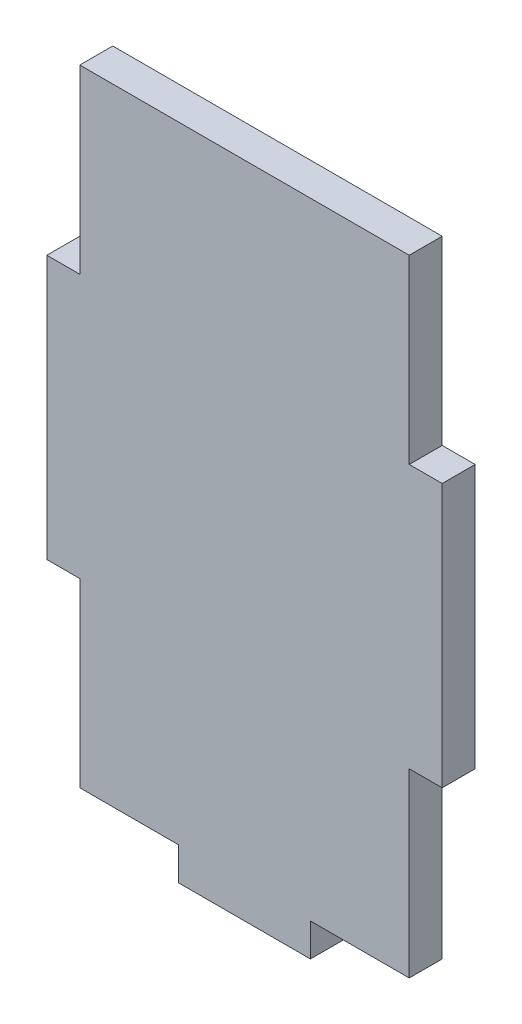
ISO-10303-21;
HEADER;
FILE_DESCRIPTION(('STEP AP214'),'2;1');
FILE_NAME('part.step','',(''),(''),'','','');
FILE_SCHEMA(('AUTOMOTIVE_DESIGN { 1 0 10303 214 1 1 1 1 }'));
ENDSEC;
DATA;
#1=APPLICATION_CONTEXT('core data for automotive mechanical design processes');
#2=APPLICATION_PROTOCOL_DEFINITION('international standard','automotive_design',2000,#1);
#3=PRODUCT_CONTEXT('',#1,'mechanical');
#4=PRODUCT('Part','Part','',(#3));
#5=PRODUCT_RELATED_PRODUCT_CATEGORY('part','',(#4));
#6=PRODUCT_DEFINITION_FORMATION('','',#4);
#7=PRODUCT_DEFINITION_CONTEXT('part definition',#1,'design');
#8=PRODUCT_DEFINITION('design','',#6,#7);
#9=PRODUCT_DEFINITION_SHAPE('','',#8);
#10=(LENGTH_UNIT() NAMED_UNIT(*) SI_UNIT(.MILLI.,.METRE.));
#11=(NAMED_UNIT(*) PLANE_ANGLE_UNIT() SI_UNIT($,.RADIAN.));
#12=(NAMED_UNIT(*) SI_UNIT($,.STERADIAN.) SOLID_ANGLE_UNIT());
#13=UNCERTAINTY_MEASURE_WITH_UNIT(LENGTH_MEASURE(1.E-05),#10,'distance_accuracy_value','');
#14=(GEOMETRIC_REPRESENTATION_CONTEXT(3) GLOBAL_UNCERTAINTY_ASSIGNED_CONTEXT((#13)) GLOBAL_UNIT_ASSIGNED_CONTEXT((#10,
#11,#12)) REPRESENTATION_CONTEXT('',''));
#15=CARTESIAN_POINT('',(0.,0.,0.));
#16=DIRECTION('',(0.,0.,1.));
#17=DIRECTION('',(1.,0.,0.));
#18=AXIS2_PLACEMENT_3D('',#15,#16,#17);
#19=CARTESIAN_POINT('',(-31.75,60.325,3.175));
#20=DIRECTION('',(1.,0.,0.));
#21=DIRECTION('',(0.,0.,-1.));
#22=AXIS2_PLACEMENT_3D('',#19,#20,#21);
#23=PLANE('',#22);
#24=DIRECTION('',(0.,-1.,0.));
#25=VECTOR('',#24,1.);
#26=CARTESIAN_POINT('',(-31.75,60.325,-3.175));
#27=LINE('',#26,#25);
#28=CARTESIAN_POINT('',(-31.75,60.325,-3.175));
#29=VERTEX_POINT('',#28);
#30=CARTESIAN_POINT('',(-31.75,25.4,-3.175));
#31=VERTEX_POINT('',#30);
#32=EDGE_CURVE('E187',#29,#31,#27,.T.);
#33=ORIENTED_EDGE('',*,*,#32,.T.);
#34=DIRECTION('',(0.,0.,-1.));
#35=VECTOR('',#34,1.);
#36=CARTESIAN_POINT('',(-31.75,25.4,3.175));
#37=LINE('',#36,#35);
#38=CARTESIAN_POINT('',(-31.75,25.4,3.175));
#39=VERTEX_POINT('',#38);
#40=EDGE_CURVE('E11',#39,#31,#37,.T.);
#41=ORIENTED_EDGE('',*,*,#40,.F.);
#42=DIRECTION('',(0.,-1.,0.));
#43=VECTOR('',#42,1.);
#44=CARTESIAN_POINT('',(-31.75,60.325,3.175));
#45=LINE('',#44,#43);
#46=CARTESIAN_POINT('',(-31.75,60.325,3.175));
#47=VERTEX_POINT('',#46);
#48=EDGE_CURVE('E233',#47,#39,#45,.T.);
#49=ORIENTED_EDGE('',*,*,#48,.F.);
#50=DIRECTION('',(0.,0.,-1.));
#51=VECTOR('',#50,1.);
#52=CARTESIAN_POINT('',(-31.75,60.325,3.175));
#53=LINE('',#52,#51);
#54=EDGE_CURVE('E183',#47,#29,#53,.T.);
#55=ORIENTED_EDGE('',*,*,#54,.T.);
#56=EDGE_LOOP('',(#33,#41,#49,#55));
#57=FACE_BOUND('',#56,.T.);
#58=ADVANCED_FACE('F38',(#57),#23,.F.);
#59=CARTESIAN_POINT('',(-31.75,25.4,3.175));
#60=DIRECTION('',(0.,-1.,0.));
#61=DIRECTION('',(0.,0.,-1.));
#62=AXIS2_PLACEMENT_3D('',#59,#60,#61);
#63=PLANE('',#62);
#64=DIRECTION('',(-1.,0.,0.));
#65=VECTOR('',#64,1.);
#66=CARTESIAN_POINT('',(-31.75,25.4,-3.175));
#67=LINE('',#66,#65);
#68=CARTESIAN_POINT('',(-38.1,25.4,-3.175));
#69=VERTEX_POINT('',#68);
#70=EDGE_CURVE('E191',#31,#69,#67,.T.);
#71=ORIENTED_EDGE('',*,*,#70,.T.);
#72=DIRECTION('',(0.,0.,-1.));
#73=VECTOR('',#72,1.);
#74=CARTESIAN_POINT('',(-38.1,25.4,3.175));
#75=LINE('',#74,#73);
#76=CARTESIAN_POINT('',(-38.1,25.4,3.175));
#77=VERTEX_POINT('',#76);
#78=EDGE_CURVE('E47',#77,#69,#75,.T.);
#79=ORIENTED_EDGE('',*,*,#78,.F.);
#80=DIRECTION('',(-1.,0.,0.));
#81=VECTOR('',#80,1.);
#82=CARTESIAN_POINT('',(-31.75,25.4,3.175));
#83=LINE('',#82,#81);
#84=EDGE_CURVE('E122',#39,#77,#83,.T.);
#85=ORIENTED_EDGE('',*,*,#84,.F.);
#86=ORIENTED_EDGE('',*,*,#40,.T.);
#87=EDGE_LOOP('',(#71,#79,#85,#86));
#88=FACE_BOUND('',#87,.T.);
#89=ADVANCED_FACE('F355',(#88),#63,.F.);
#90=CARTESIAN_POINT('',(-38.1,25.4,3.175));
#91=DIRECTION('',(1.,0.,0.));
#92=DIRECTION('',(0.,1.,0.));
#93=AXIS2_PLACEMENT_3D('',#90,#91,#92);
#94=PLANE('',#93);
#95=DIRECTION('',(0.,-1.,0.));
#96=VECTOR('',#95,1.);
#97=CARTESIAN_POINT('',(-38.1,25.4,-3.175));
#98=LINE('',#97,#96);
#99=CARTESIAN_POINT('',(-38.1,-25.4,-3.175));
#100=VERTEX_POINT('',#99);
#101=EDGE_CURVE('E194',#69,#100,#98,.T.);
#102=ORIENTED_EDGE('',*,*,#101,.T.);
#103=DIRECTION('',(0.,0.,-1.));
#104=VECTOR('',#103,1.);
#105=CARTESIAN_POINT('',(-38.1,-25.4,3.175));
#106=LINE('',#105,#104);
#107=CARTESIAN_POINT('',(-38.1,-25.4,3.175));
#108=VERTEX_POINT('',#107);
#109=EDGE_CURVE('E276',#108,#100,#106,.T.);
#110=ORIENTED_EDGE('',*,*,#109,.F.);
#111=DIRECTION('',(0.,-1.,0.));
#112=VECTOR('',#111,1.);
#113=CARTESIAN_POINT('',(-38.1,25.4,3.175));
#114=LINE('',#113,#112);
#115=EDGE_CURVE('E286',#77,#108,#114,.T.);
#116=ORIENTED_EDGE('',*,*,#115,.F.);
#117=ORIENTED_EDGE('',*,*,#78,.T.);
#118=EDGE_LOOP('',(#102,#110,#116,#117));
#119=FACE_BOUND('',#118,.T.);
#120=ADVANCED_FACE('F284',(#119),#94,.F.);
#121=CARTESIAN_POINT('',(-31.75,-25.4,3.175));
#122=DIRECTION('',(0.,1.,0.));
#123=DIRECTION('',(0.,0.,1.));
#124=AXIS2_PLACEMENT_3D('',#121,#122,#123);
#125=PLANE('',#124);
#126=DIRECTION('',(1.,0.,0.));
#127=VECTOR('',#126,1.);
#128=CARTESIAN_POINT('',(-31.75,-25.4,-3.175));
#129=LINE('',#128,#127);
#130=CARTESIAN_POINT('',(-31.75,-25.4,-3.175));
#131=VERTEX_POINT('',#130);
#132=EDGE_CURVE('E197',#100,#131,#129,.T.);
#133=ORIENTED_EDGE('',*,*,#132,.T.);
#134=DIRECTION('',(0.,0.,-1.));
#135=VECTOR('',#134,1.);
#136=CARTESIAN_POINT('',(-31.75,-25.4,3.175));
#137=LINE('',#136,#135);
#138=CARTESIAN_POINT('',(-31.75,-25.4,3.175));
#139=VERTEX_POINT('',#138);
#140=EDGE_CURVE('E272',#139,#131,#137,.T.);
#141=ORIENTED_EDGE('',*,*,#140,.F.);
#142=DIRECTION('',(1.,0.,0.));
#143=VECTOR('',#142,1.);
#144=CARTESIAN_POINT('',(-31.75,-25.4,3.175));
#145=LINE('',#144,#143);
#146=EDGE_CURVE('E305',#108,#139,#145,.T.);
#147=ORIENTED_EDGE('',*,*,#146,.F.);
#148=ORIENTED_EDGE('',*,*,#109,.T.);
#149=EDGE_LOOP('',(#133,#141,#147,#148));
#150=FACE_BOUND('',#149,.T.);
#151=ADVANCED_FACE('F295',(#150),#125,.F.);
#152=CARTESIAN_POINT('',(-31.75,-25.4,3.175));
#153=DIRECTION('',(1.,0.,0.));
#154=DIRECTION('',(0.,1.,0.));
#155=AXIS2_PLACEMENT_3D('',#152,#153,#154);
#156=PLANE('',#155);
#157=DIRECTION('',(0.,-1.,0.));
#158=VECTOR('',#157,1.);
#159=CARTESIAN_POINT('',(-31.75,-25.4,-3.175));
#160=LINE('',#159,#158);
#161=CARTESIAN_POINT('',(-31.75,-60.325,-3.175));
#162=VERTEX_POINT('',#161);
#163=EDGE_CURVE('E200',#131,#162,#160,.T.);
#164=ORIENTED_EDGE('',*,*,#163,.T.);
#165=DIRECTION('',(0.,0.,-1.));
#166=VECTOR('',#165,1.);
#167=CARTESIAN_POINT('',(-31.75,-60.325,3.175));
#168=LINE('',#167,#166);
#169=CARTESIAN_POINT('',(-31.75,-60.325,3.175));
#170=VERTEX_POINT('',#169);
#171=EDGE_CURVE('E268',#170,#162,#168,.T.);
#172=ORIENTED_EDGE('',*,*,#171,.F.);
#173=DIRECTION('',(0.,-1.,0.));
#174=VECTOR('',#173,1.);
#175=CARTESIAN_POINT('',(-31.75,-25.4,3.175));
#176=LINE('',#175,#174);
#177=EDGE_CURVE('E301',#139,#170,#176,.T.);
#178=ORIENTED_EDGE('',*,*,#177,.F.);
#179=ORIENTED_EDGE('',*,*,#140,.T.);
#180=EDGE_LOOP('',(#164,#172,#178,#179));
#181=FACE_BOUND('',#180,.T.);
#182=ADVANCED_FACE('F299',(#181),#156,.F.);
#183=CARTESIAN_POINT('',(-31.75,-60.325,3.175));
#184=DIRECTION('',(0.,1.,0.));
#185=DIRECTION('',(0.,0.,1.));
#186=AXIS2_PLACEMENT_3D('',#183,#184,#185);
#187=PLANE('',#186);
#188=DIRECTION('',(1.,0.,0.));
#189=VECTOR('',#188,1.);
#190=CARTESIAN_POINT('',(-31.75,-60.325,-3.175));
#191=LINE('',#190,#189);
#192=CARTESIAN_POINT('',(-12.7,-60.325,-3.175));
#193=VERTEX_POINT('',#192);
#194=EDGE_CURVE('E203',#162,#193,#191,.T.);
#195=ORIENTED_EDGE('',*,*,#194,.T.);
#196=DIRECTION('',(0.,0.,-1.));
#197=VECTOR('',#196,1.);
#198=CARTESIAN_POINT('',(-12.7,-60.325,3.175));
#199=LINE('',#198,#197);
#200=CARTESIAN_POINT('',(-12.7,-60.325,3.175));
#201=VERTEX_POINT('',#200);
#202=EDGE_CURVE('E264',#201,#193,#199,.T.);
#203=ORIENTED_EDGE('',*,*,#202,.F.);
#204=DIRECTION('',(1.,0.,0.));
#205=VECTOR('',#204,1.);
#206=CARTESIAN_POINT('',(-31.75,-60.325,3.175));
#207=LINE('',#206,#205);
#208=EDGE_CURVE('E304',#170,#201,#207,.T.);
#209=ORIENTED_EDGE('',*,*,#208,.F.);
#210=ORIENTED_EDGE('',*,*,#171,.T.);
#211=EDGE_LOOP('',(#195,#203,#209,#210));
#212=FACE_BOUND('',#211,.T.);
#213=ADVANCED_FACE('F368',(#212),#187,.F.);
#214=CARTESIAN_POINT('',(-12.7,-60.325,3.175));
#215=DIRECTION('',(1.,0.,0.));
#216=DIRECTION('',(0.,0.,-1.));
#217=AXIS2_PLACEMENT_3D('',#214,#215,#216);
#218=PLANE('',#217);
#219=DIRECTION('',(0.,-1.,0.));
#220=VECTOR('',#219,1.);
#221=CARTESIAN_POINT('',(-12.7,-60.325,-3.175));
#222=LINE('',#221,#220);
#223=CARTESIAN_POINT('',(-12.7,-66.675,-3.175));
#224=VERTEX_POINT('',#223);
#225=EDGE_CURVE('E206',#193,#224,#222,.T.);
#226=ORIENTED_EDGE('',*,*,#225,.T.);
#227=DIRECTION('',(0.,0.,-1.));
#228=VECTOR('',#227,1.);
#229=CARTESIAN_POINT('',(-12.7,-66.675,3.175));
#230=LINE('',#229,#228);
#231=CARTESIAN_POINT('',(-12.7,-66.675,3.175));
#232=VERTEX_POINT('',#231);
#233=EDGE_CURVE('E260',#232,#224,#230,.T.);
#234=ORIENTED_EDGE('',*,*,#233,.F.);
#235=DIRECTION('',(0.,-1.,0.));
#236=VECTOR('',#235,1.);
#237=CARTESIAN_POINT('',(-12.7,-60.325,3.175));
#238=LINE('',#237,#236);
#239=EDGE_CURVE('E309',#201,#232,#238,.T.);
#240=ORIENTED_EDGE('',*,*,#239,.F.);
#241=ORIENTED_EDGE('',*,*,#202,.T.);
#242=EDGE_LOOP('',(#226,#234,#240,#241));
#243=FACE_BOUND('',#242,.T.);
#244=ADVANCED_FACE('F371',(#243),#218,.F.);
#245=CARTESIAN_POINT('',(-12.7,-66.675,3.175));
#246=DIRECTION('',(0.,1.,0.));
#247=DIRECTION('',(0.,0.,1.));
#248=AXIS2_PLACEMENT_3D('',#245,#246,#247);
#249=PLANE('',#248);
#250=DIRECTION('',(1.,0.,0.));
#251=VECTOR('',#250,1.);
#252=CARTESIAN_POINT('',(-12.7,-66.675,-3.175));
#253=LINE('',#252,#251);
#254=CARTESIAN_POINT('',(12.7,-66.675,-3.175));
#255=VERTEX_POINT('',#254);
#256=EDGE_CURVE('E209',#224,#255,#253,.T.);
#257=ORIENTED_EDGE('',*,*,#256,.T.);
#258=DIRECTION('',(0.,0.,-1.));
#259=VECTOR('',#258,1.);
#260=CARTESIAN_POINT('',(12.7,-66.675,3.175));
#261=LINE('',#260,#259);
#262=CARTESIAN_POINT('',(12.7,-66.675,3.175));
#263=VERTEX_POINT('',#262);
#264=EDGE_CURVE('E256',#263,#255,#261,.T.);
#265=ORIENTED_EDGE('',*,*,#264,.F.);
#266=DIRECTION('',(1.,0.,0.));
#267=VECTOR('',#266,1.);
#268=CARTESIAN_POINT('',(-12.7,-66.675,3.175));
#269=LINE('',#268,#267);
#270=EDGE_CURVE('E316',#232,#263,#269,.T.);
#271=ORIENTED_EDGE('',*,*,#270,.F.);
#272=ORIENTED_EDGE('',*,*,#233,.T.);
#273=EDGE_LOOP('',(#257,#265,#271,#272));
#274=FACE_BOUND('',#273,.T.);
#275=ADVANCED_FACE('F375',(#274),#249,.F.);
#276=CARTESIAN_POINT('',(12.7,-60.325,3.175));
#277=DIRECTION('',(-1.,0.,0.));
#278=DIRECTION('',(0.,0.,1.));
#279=AXIS2_PLACEMENT_3D('',#276,#277,#278);
#280=PLANE('',#279);
#281=DIRECTION('',(0.,1.,0.));
#282=VECTOR('',#281,1.);
#283=CARTESIAN_POINT('',(12.7,-60.325,-3.175));
#284=LINE('',#283,#282);
#285=CARTESIAN_POINT('',(12.7,-60.325,-3.175));
#286=VERTEX_POINT('',#285);
#287=EDGE_CURVE('E212',#255,#286,#284,.T.);
#288=ORIENTED_EDGE('',*,*,#287,.T.);
#289=DIRECTION('',(0.,0.,-1.));
#290=VECTOR('',#289,1.);
#291=CARTESIAN_POINT('',(12.7,-60.325,3.175));
#292=LINE('',#291,#290);
#293=CARTESIAN_POINT('',(12.7,-60.325,3.175));
#294=VERTEX_POINT('',#293);
#295=EDGE_CURVE('E252',#294,#286,#292,.T.);
#296=ORIENTED_EDGE('',*,*,#295,.F.);
#297=DIRECTION('',(0.,1.,0.));
#298=VECTOR('',#297,1.);
#299=CARTESIAN_POINT('',(12.7,-60.325,3.175));
#300=LINE('',#299,#298);
#301=EDGE_CURVE('E319',#263,#294,#300,.T.);
#302=ORIENTED_EDGE('',*,*,#301,.F.);
#303=ORIENTED_EDGE('',*,*,#264,.T.);
#304=EDGE_LOOP('',(#288,#296,#302,#303));
#305=FACE_BOUND('',#304,.T.);
#306=ADVANCED_FACE('F379',(#305),#280,.F.);
#307=CARTESIAN_POINT('',(31.75,-60.325,3.175));
#308=DIRECTION('',(0.,1.,0.));
#309=DIRECTION('',(0.,0.,1.));
#310=AXIS2_PLACEMENT_3D('',#307,#308,#309);
#311=PLANE('',#310);
#312=DIRECTION('',(1.,0.,0.));
#313=VECTOR('',#312,1.);
#314=CARTESIAN_POINT('',(31.75,-60.325,-3.175));
#315=LINE('',#314,#313);
#316=CARTESIAN_POINT('',(31.75,-60.325,-3.175));
#317=VERTEX_POINT('',#316);
#318=EDGE_CURVE('E215',#286,#317,#315,.T.);
#319=ORIENTED_EDGE('',*,*,#318,.T.);
#320=DIRECTION('',(0.,0.,-1.));
#321=VECTOR('',#320,1.);
#322=CARTESIAN_POINT('',(31.75,-60.325,3.175));
#323=LINE('',#322,#321);
#324=CARTESIAN_POINT('',(31.75,-60.325,3.175));
#325=VERTEX_POINT('',#324);
#326=EDGE_CURVE('E248',#325,#317,#323,.T.);
#327=ORIENTED_EDGE('',*,*,#326,.F.);
#328=DIRECTION('',(1.,0.,0.));
#329=VECTOR('',#328,1.);
#330=CARTESIAN_POINT('',(31.75,-60.325,3.175));
#331=LINE('',#330,#329);
#332=EDGE_CURVE('E322',#294,#325,#331,.T.);
#333=ORIENTED_EDGE('',*,*,#332,.F.);
#334=ORIENTED_EDGE('',*,*,#295,.T.);
#335=EDGE_LOOP('',(#319,#327,#333,#334));
#336=FACE_BOUND('',#335,.T.);
#337=ADVANCED_FACE('F383',(#336),#311,.F.);
#338=CARTESIAN_POINT('',(31.75,-25.4,3.175));
#339=DIRECTION('',(-1.,0.,0.));
#340=DIRECTION('',(0.,-1.,0.));
#341=AXIS2_PLACEMENT_3D('',#338,#339,#340);
#342=PLANE('',#341);
#343=DIRECTION('',(0.,1.,0.));
#344=VECTOR('',#343,1.);
#345=CARTESIAN_POINT('',(31.75,-25.4,-3.175));
#346=LINE('',#345,#344);
#347=CARTESIAN_POINT('',(31.75,-25.4,-3.175));
#348=VERTEX_POINT('',#347);
#349=EDGE_CURVE('E218',#317,#348,#346,.T.);
#350=ORIENTED_EDGE('',*,*,#349,.T.);
#351=DIRECTION('',(0.,0.,-1.));
#352=VECTOR('',#351,1.);
#353=CARTESIAN_POINT('',(31.75,-25.4,3.175));
#354=LINE('',#353,#352);
#355=CARTESIAN_POINT('',(31.75,-25.4,3.175));
#356=VERTEX_POINT('',#355);
#357=EDGE_CURVE('E244',#356,#348,#354,.T.);
#358=ORIENTED_EDGE('',*,*,#357,.F.);
#359=DIRECTION('',(0.,1.,0.));
#360=VECTOR('',#359,1.);
#361=CARTESIAN_POINT('',(31.75,-25.4,3.175));
#362=LINE('',#361,#360);
#363=EDGE_CURVE('E325',#325,#356,#362,.T.);
#364=ORIENTED_EDGE('',*,*,#363,.F.);
#365=ORIENTED_EDGE('',*,*,#326,.T.);
#366=EDGE_LOOP('',(#350,#358,#364,#365));
#367=FACE_BOUND('',#366,.T.);
#368=ADVANCED_FACE('F387',(#367),#342,.F.);
#369=CARTESIAN_POINT('',(31.75,-25.4,3.175));
#370=DIRECTION('',(0.,1.,0.));
#371=DIRECTION('',(0.,0.,1.));
#372=AXIS2_PLACEMENT_3D('',#369,#370,#371);
#373=PLANE('',#372);
#374=DIRECTION('',(1.,0.,0.));
#375=VECTOR('',#374,1.);
#376=CARTESIAN_POINT('',(31.75,-25.4,-3.175));
#377=LINE('',#376,#375);
#378=CARTESIAN_POINT('',(38.1,-25.4,-3.175));
#379=VERTEX_POINT('',#378);
#380=EDGE_CURVE('E221',#348,#379,#377,.T.);
#381=ORIENTED_EDGE('',*,*,#380,.T.);
#382=DIRECTION('',(0.,0.,-1.));
#383=VECTOR('',#382,1.);
#384=CARTESIAN_POINT('',(38.1,-25.4,3.175));
#385=LINE('',#384,#383);
#386=CARTESIAN_POINT('',(38.1,-25.4,3.175));
#387=VERTEX_POINT('',#386);
#388=EDGE_CURVE('E240',#387,#379,#385,.T.);
#389=ORIENTED_EDGE('',*,*,#388,.F.);
#390=DIRECTION('',(1.,0.,0.));
#391=VECTOR('',#390,1.);
#392=CARTESIAN_POINT('',(31.75,-25.4,3.175));
#393=LINE('',#392,#391);
#394=EDGE_CURVE('E328',#356,#387,#393,.T.);
#395=ORIENTED_EDGE('',*,*,#394,.F.);
#396=ORIENTED_EDGE('',*,*,#357,.T.);
#397=EDGE_LOOP('',(#381,#389,#395,#396));
#398=FACE_BOUND('',#397,.T.);
#399=ADVANCED_FACE('F336',(#398),#373,.F.);
#400=CARTESIAN_POINT('',(38.1,25.4,3.175));
#401=DIRECTION('',(-1.,0.,0.));
#402=DIRECTION('',(0.,-1.,0.));
#403=AXIS2_PLACEMENT_3D('',#400,#401,#402);
#404=PLANE('',#403);
#405=DIRECTION('',(0.,1.,0.));
#406=VECTOR('',#405,1.);
#407=CARTESIAN_POINT('',(38.1,25.4,-3.175));
#408=LINE('',#407,#406);
#409=CARTESIAN_POINT('',(38.1,25.4,-3.175));
#410=VERTEX_POINT('',#409);
#411=EDGE_CURVE('E224',#379,#410,#408,.T.);
#412=ORIENTED_EDGE('',*,*,#411,.T.);
#413=DIRECTION('',(0.,0.,-1.));
#414=VECTOR('',#413,1.);
#415=CARTESIAN_POINT('',(38.1,25.4,3.175));
#416=LINE('',#415,#414);
#417=CARTESIAN_POINT('',(38.1,25.4,3.175));
#418=VERTEX_POINT('',#417);
#419=EDGE_CURVE('E176',#418,#410,#416,.T.);
#420=ORIENTED_EDGE('',*,*,#419,.F.);
#421=DIRECTION('',(0.,1.,0.));
#422=VECTOR('',#421,1.);
#423=CARTESIAN_POINT('',(38.1,25.4,3.175));
#424=LINE('',#423,#422);
#425=EDGE_CURVE('E165',#387,#418,#424,.T.);
#426=ORIENTED_EDGE('',*,*,#425,.F.);
#427=ORIENTED_EDGE('',*,*,#388,.T.);
#428=EDGE_LOOP('',(#412,#420,#426,#427));
#429=FACE_BOUND('',#428,.T.);
#430=ADVANCED_FACE('F340',(#429),#404,.F.);
#431=CARTESIAN_POINT('',(31.75,25.4,3.175));
#432=DIRECTION('',(0.,-1.,0.));
#433=DIRECTION('',(1.,0.,0.));
#434=AXIS2_PLACEMENT_3D('',#431,#432,#433);
#435=PLANE('',#434);
#436=DIRECTION('',(-1.,0.,0.));
#437=VECTOR('',#436,1.);
#438=CARTESIAN_POINT('',(31.75,25.4,-3.175));
#439=LINE('',#438,#437);
#440=CARTESIAN_POINT('',(31.75,25.4,-3.175));
#441=VERTEX_POINT('',#440);
#442=EDGE_CURVE('E174',#410,#441,#439,.T.);
#443=ORIENTED_EDGE('',*,*,#442,.T.);
#444=DIRECTION('',(0.,0.,-1.));
#445=VECTOR('',#444,1.);
#446=CARTESIAN_POINT('',(31.75,25.4,3.175));
#447=LINE('',#446,#445);
#448=CARTESIAN_POINT('',(31.75,25.4,3.175));
#449=VERTEX_POINT('',#448);
#450=EDGE_CURVE('E171',#449,#441,#447,.T.);
#451=ORIENTED_EDGE('',*,*,#450,.F.);
#452=DIRECTION('',(-1.,0.,0.));
#453=VECTOR('',#452,1.);
#454=CARTESIAN_POINT('',(31.75,25.4,3.175));
#455=LINE('',#454,#453);
#456=EDGE_CURVE('E159',#418,#449,#455,.T.);
#457=ORIENTED_EDGE('',*,*,#456,.F.);
#458=ORIENTED_EDGE('',*,*,#419,.T.);
#459=EDGE_LOOP('',(#443,#451,#457,#458));
#460=FACE_BOUND('',#459,.T.);
#461=ADVANCED_FACE('F172',(#460),#435,.F.);
#462=CARTESIAN_POINT('',(31.75,60.325,3.175));
#463=DIRECTION('',(-1.,0.,0.));
#464=DIRECTION('',(0.,-1.,0.));
#465=AXIS2_PLACEMENT_3D('',#462,#463,#464);
#466=PLANE('',#465);
#467=DIRECTION('',(0.,1.,0.));
#468=VECTOR('',#467,1.);
#469=CARTESIAN_POINT('',(31.75,60.325,-3.175));
#470=LINE('',#469,#468);
#471=CARTESIAN_POINT('',(31.75,60.325,-3.175));
#472=VERTEX_POINT('',#471);
#473=EDGE_CURVE('E108',#441,#472,#470,.T.);
#474=ORIENTED_EDGE('',*,*,#473,.T.);
#475=DIRECTION('',(0.,0.,-1.));
#476=VECTOR('',#475,1.);
#477=CARTESIAN_POINT('',(31.75,60.325,3.175));
#478=LINE('',#477,#476);
#479=CARTESIAN_POINT('',(31.75,60.325,3.175));
#480=VERTEX_POINT('',#479);
#481=EDGE_CURVE('E177',#480,#472,#478,.T.);
#482=ORIENTED_EDGE('',*,*,#481,.F.);
#483=DIRECTION('',(0.,1.,0.));
#484=VECTOR('',#483,1.);
#485=CARTESIAN_POINT('',(31.75,60.325,3.175));
#486=LINE('',#485,#484);
#487=EDGE_CURVE('E163',#449,#480,#486,.T.);
#488=ORIENTED_EDGE('',*,*,#487,.F.);
#489=ORIENTED_EDGE('',*,*,#450,.T.);
#490=EDGE_LOOP('',(#474,#482,#488,#489));
#491=FACE_BOUND('',#490,.T.);
#492=ADVANCED_FACE('F179',(#491),#466,.F.);
#493=CARTESIAN_POINT('',(-31.75,60.325,3.175));
#494=DIRECTION('',(0.,-1.,0.));
#495=DIRECTION('',(1.,0.,0.));
#496=AXIS2_PLACEMENT_3D('',#493,#494,#495);
#497=PLANE('',#496);
#498=DIRECTION('',(-1.,0.,0.));
#499=VECTOR('',#498,1.);
#500=CARTESIAN_POINT('',(-31.75,60.325,-3.175));
#501=LINE('',#500,#499);
#502=EDGE_CURVE('E114',#472,#29,#501,.T.);
#503=ORIENTED_EDGE('',*,*,#502,.T.);
#504=ORIENTED_EDGE('',*,*,#54,.F.);
#505=DIRECTION('',(-1.,0.,0.));
#506=VECTOR('',#505,1.);
#507=CARTESIAN_POINT('',(-31.75,60.325,3.175));
#508=LINE('',#507,#506);
#509=EDGE_CURVE('E55',#480,#47,#508,.T.);
#510=ORIENTED_EDGE('',*,*,#509,.F.);
#511=ORIENTED_EDGE('',*,*,#481,.T.);
#512=EDGE_LOOP('',(#503,#504,#510,#511));
#513=FACE_BOUND('',#512,.T.);
#514=ADVANCED_FACE('F344',(#513),#497,.F.);
#515=CARTESIAN_POINT('',(0.,0.,3.175));
#516=DIRECTION('',(0.,0.,-1.));
#517=DIRECTION('',(-1.,0.,0.));
#518=AXIS2_PLACEMENT_3D('',#515,#516,#517);
#519=PLANE('',#518);
#520=ORIENTED_EDGE('',*,*,#48,.T.);
#521=ORIENTED_EDGE('',*,*,#84,.T.);
#522=ORIENTED_EDGE('',*,*,#115,.T.);
#523=ORIENTED_EDGE('',*,*,#146,.T.);
#524=ORIENTED_EDGE('',*,*,#177,.T.);
#525=ORIENTED_EDGE('',*,*,#208,.T.);
#526=ORIENTED_EDGE('',*,*,#239,.T.);
#527=ORIENTED_EDGE('',*,*,#270,.T.);
#528=ORIENTED_EDGE('',*,*,#301,.T.);
#529=ORIENTED_EDGE('',*,*,#332,.T.);
#530=ORIENTED_EDGE('',*,*,#363,.T.);
#531=ORIENTED_EDGE('',*,*,#394,.T.);
#532=ORIENTED_EDGE('',*,*,#425,.T.);
#533=ORIENTED_EDGE('',*,*,#456,.T.);
#534=ORIENTED_EDGE('',*,*,#487,.T.);
#535=ORIENTED_EDGE('',*,*,#509,.T.);
#536=EDGE_LOOP('',(#520,#521,#522,#523,#524,#525,#526,#527,#528,#529,#530,#531,#532,#533,#534,#535));
#537=FACE_BOUND('',#536,.T.);
#538=ADVANCED_FACE('F161',(#537),#519,.F.);
#539=CARTESIAN_POINT('',(0.,0.,-3.175));
#540=DIRECTION('',(0.,0.,-1.));
#541=DIRECTION('',(-1.,0.,0.));
#542=AXIS2_PLACEMENT_3D('',#539,#540,#541);
#543=PLANE('',#542);
#544=ORIENTED_EDGE('',*,*,#32,.F.);
#545=ORIENTED_EDGE('',*,*,#502,.F.);
#546=ORIENTED_EDGE('',*,*,#473,.F.);
#547=ORIENTED_EDGE('',*,*,#442,.F.);
#548=ORIENTED_EDGE('',*,*,#411,.F.);
#549=ORIENTED_EDGE('',*,*,#380,.F.);
#550=ORIENTED_EDGE('',*,*,#349,.F.);
#551=ORIENTED_EDGE('',*,*,#318,.F.);
#552=ORIENTED_EDGE('',*,*,#287,.F.);
#553=ORIENTED_EDGE('',*,*,#256,.F.);
#554=ORIENTED_EDGE('',*,*,#225,.F.);
#555=ORIENTED_EDGE('',*,*,#194,.F.);
#556=ORIENTED_EDGE('',*,*,#163,.F.);
#557=ORIENTED_EDGE('',*,*,#132,.F.);
#558=ORIENTED_EDGE('',*,*,#101,.F.);
#559=ORIENTED_EDGE('',*,*,#70,.F.);
#560=EDGE_LOOP('',(#544,#545,#546,#547,#548,#549,#550,#551,#552,#553,#554,#555,#556,#557,#558,#559));
#561=FACE_BOUND('',#560,.T.);
#562=ADVANCED_FACE('F290',(#561),#543,.T.);
#563=CLOSED_SHELL('',(#58,#89,#120,#151,#182,#213,#244,#275,#306,#337,#368,#399,#430,#461,#492,
#514,#538,#562));
#564=MANIFOLD_SOLID_BREP('B2',#563);
#565=ADVANCED_BREP_SHAPE_REPRESENTATION('',(#18,#564),#14);
#566=SHAPE_DEFINITION_REPRESENTATION(#9,#565);
ENDSEC;
END-ISO-10303-21;
